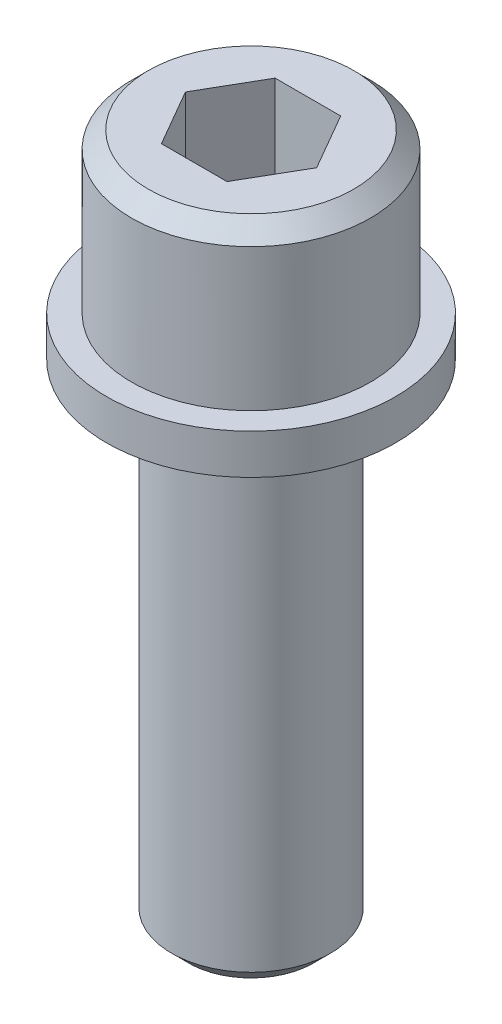
ISO-10303-21;
HEADER;
FILE_DESCRIPTION(('STEP AP214'),'2;1');
FILE_NAME('part.step','',(''),(''),'','','');
FILE_SCHEMA(('AUTOMOTIVE_DESIGN { 1 0 10303 214 1 1 1 1 }'));
ENDSEC;
DATA;
#1=APPLICATION_CONTEXT('core data for automotive mechanical design processes');
#2=APPLICATION_PROTOCOL_DEFINITION('international standard','automotive_design',2000,#1);
#3=PRODUCT_CONTEXT('',#1,'mechanical');
#4=PRODUCT('Part','Part','',(#3));
#5=PRODUCT_RELATED_PRODUCT_CATEGORY('part','',(#4));
#6=PRODUCT_DEFINITION_FORMATION('','',#4);
#7=PRODUCT_DEFINITION_CONTEXT('part definition',#1,'design');
#8=PRODUCT_DEFINITION('design','',#6,#7);
#9=PRODUCT_DEFINITION_SHAPE('','',#8);
#10=(LENGTH_UNIT() NAMED_UNIT(*) SI_UNIT(.MILLI.,.METRE.));
#11=(NAMED_UNIT(*) PLANE_ANGLE_UNIT() SI_UNIT($,.RADIAN.));
#12=(NAMED_UNIT(*) SI_UNIT($,.STERADIAN.) SOLID_ANGLE_UNIT());
#13=UNCERTAINTY_MEASURE_WITH_UNIT(LENGTH_MEASURE(1.E-05),#10,'distance_accuracy_value','');
#14=(GEOMETRIC_REPRESENTATION_CONTEXT(3) GLOBAL_UNCERTAINTY_ASSIGNED_CONTEXT((#13)) GLOBAL_UNIT_ASSIGNED_CONTEXT((#10,
#11,#12)) REPRESENTATION_CONTEXT('',''));
#15=CARTESIAN_POINT('',(0.,0.,0.));
#16=DIRECTION('',(0.,0.,1.));
#17=DIRECTION('',(1.,0.,0.));
#18=AXIS2_PLACEMENT_3D('',#15,#16,#17);
#19=CARTESIAN_POINT('',(4.75,0.,0.));
#20=DIRECTION('',(0.,-1.,0.));
#21=DIRECTION('',(0.,0.,-1.));
#22=AXIS2_PLACEMENT_3D('',#19,#20,#21);
#23=PLANE('',#22);
#24=CARTESIAN_POINT('',(0.,0.,0.));
#25=DIRECTION('',(0.,-1.,0.));
#26=DIRECTION('',(0.,0.,-1.));
#27=AXIS2_PLACEMENT_3D('',#24,#25,#26);
#28=CIRCLE('',#27,3.75);
#29=CARTESIAN_POINT('',(0.,0.,-3.75));
#30=VERTEX_POINT('',#29);
#31=EDGE_CURVE('E188',#30,#30,#28,.T.);
#32=ORIENTED_EDGE('',*,*,#31,.T.);
#33=EDGE_LOOP('',(#32));
#34=FACE_BOUND('',#33,.T.);
#35=ADVANCED_FACE('F47',(#34),#23,.T.);
#36=CARTESIAN_POINT('',(0.,41.3,0.));
#37=DIRECTION('',(0.,1.,0.));
#38=DIRECTION('',(0.,0.,1.));
#39=AXIS2_PLACEMENT_3D('',#36,#37,#38);
#40=PLANE('',#39);
#41=CARTESIAN_POINT('',(0.,41.3,0.));
#42=DIRECTION('',(0.,1.,0.));
#43=DIRECTION('',(0.,0.,1.));
#44=AXIS2_PLACEMENT_3D('',#41,#42,#43);
#45=CIRCLE('',#44,6.14999999999999);
#46=CARTESIAN_POINT('',(0.,41.3,6.14999999999999));
#47=VERTEX_POINT('',#46);
#48=EDGE_CURVE('E11',#47,#47,#45,.T.);
#49=ORIENTED_EDGE('',*,*,#48,.T.);
#50=EDGE_LOOP('',(#49));
#51=FACE_BOUND('',#50,.T.);
#52=DIRECTION('',(0.5,0.,-0.866025403784439));
#53=VECTOR('',#52,1.);
#54=CARTESIAN_POINT('',(1.96299091524473,41.3,3.4));
#55=LINE('',#54,#53);
#56=CARTESIAN_POINT('',(1.96299091524473,41.3,3.4));
#57=VERTEX_POINT('',#56);
#58=CARTESIAN_POINT('',(3.92598183048946,41.3,0.));
#59=VERTEX_POINT('',#58);
#60=EDGE_CURVE('E64',#57,#59,#55,.T.);
#61=ORIENTED_EDGE('',*,*,#60,.F.);
#62=DIRECTION('',(1.,0.,0.));
#63=VECTOR('',#62,1.);
#64=CARTESIAN_POINT('',(-1.96299091524473,41.3,3.4));
#65=LINE('',#64,#63);
#66=CARTESIAN_POINT('',(-1.96299091524473,41.3,3.4));
#67=VERTEX_POINT('',#66);
#68=EDGE_CURVE('E157',#67,#57,#65,.T.);
#69=ORIENTED_EDGE('',*,*,#68,.F.);
#70=DIRECTION('',(0.5,0.,0.866025403784439));
#71=VECTOR('',#70,1.);
#72=CARTESIAN_POINT('',(-3.92598183048946,41.3,0.));
#73=LINE('',#72,#71);
#74=CARTESIAN_POINT('',(-3.92598183048946,41.3,0.));
#75=VERTEX_POINT('',#74);
#76=EDGE_CURVE('E154',#75,#67,#73,.T.);
#77=ORIENTED_EDGE('',*,*,#76,.F.);
#78=DIRECTION('',(-0.5,0.,0.866025403784438));
#79=VECTOR('',#78,1.);
#80=CARTESIAN_POINT('',(-1.96299091524473,41.3,-3.4));
#81=LINE('',#80,#79);
#82=CARTESIAN_POINT('',(-1.96299091524473,41.3,-3.4));
#83=VERTEX_POINT('',#82);
#84=EDGE_CURVE('E112',#83,#75,#81,.T.);
#85=ORIENTED_EDGE('',*,*,#84,.F.);
#86=DIRECTION('',(-1.,0.,0.));
#87=VECTOR('',#86,1.);
#88=CARTESIAN_POINT('',(1.96299091524473,41.3,-3.4));
#89=LINE('',#88,#87);
#90=CARTESIAN_POINT('',(1.96299091524473,41.3,-3.4));
#91=VERTEX_POINT('',#90);
#92=EDGE_CURVE('E148',#91,#83,#89,.T.);
#93=ORIENTED_EDGE('',*,*,#92,.F.);
#94=DIRECTION('',(-0.5,0.,-0.866025403784438));
#95=VECTOR('',#94,1.);
#96=CARTESIAN_POINT('',(3.92598183048946,41.3,0.));
#97=LINE('',#96,#95);
#98=EDGE_CURVE('E144',#59,#91,#97,.T.);
#99=ORIENTED_EDGE('',*,*,#98,.F.);
#100=EDGE_LOOP('',(#61,#69,#77,#85,#93,#99));
#101=FACE_BOUND('',#100,.T.);
#102=ADVANCED_FACE('F211',(#51,#101),#40,.T.);
#103=CARTESIAN_POINT('',(0.,0.,0.));
#104=DIRECTION('',(0.,-1.,0.));
#105=DIRECTION('',(0.,0.,-1.));
#106=AXIS2_PLACEMENT_3D('',#103,#104,#105);
#107=CYLINDRICAL_SURFACE('',#106,7.15);
#108=CARTESIAN_POINT('',(0.,40.3,0.));
#109=DIRECTION('',(0.,1.,0.));
#110=DIRECTION('',(0.,0.,1.));
#111=AXIS2_PLACEMENT_3D('',#108,#109,#110);
#112=CIRCLE('',#111,7.15);
#113=CARTESIAN_POINT('',(0.,40.3,7.15));
#114=VERTEX_POINT('',#113);
#115=EDGE_CURVE('E57',#114,#114,#112,.F.);
#116=ORIENTED_EDGE('',*,*,#115,.T.);
#117=EDGE_LOOP('',(#116));
#118=FACE_BOUND('',#117,.T.);
#119=CARTESIAN_POINT('',(0.,31.8,0.));
#120=DIRECTION('',(0.,-1.,0.));
#121=DIRECTION('',(0.,0.,-1.));
#122=AXIS2_PLACEMENT_3D('',#119,#120,#121);
#123=CIRCLE('',#122,7.15);
#124=CARTESIAN_POINT('',(0.,31.8,-7.15));
#125=VERTEX_POINT('',#124);
#126=EDGE_CURVE('E184',#125,#125,#123,.T.);
#127=ORIENTED_EDGE('',*,*,#126,.F.);
#128=EDGE_LOOP('',(#127));
#129=FACE_BOUND('',#128,.T.);
#130=ADVANCED_FACE('F199',(#118,#129),#107,.T.);
#131=CARTESIAN_POINT('',(7.15,31.8,0.));
#132=DIRECTION('',(0.,1.,0.));
#133=DIRECTION('',(0.,0.,1.));
#134=AXIS2_PLACEMENT_3D('',#131,#132,#133);
#135=PLANE('',#134);
#136=ORIENTED_EDGE('',*,*,#126,.T.);
#137=EDGE_LOOP('',(#136));
#138=FACE_BOUND('',#137,.T.);
#139=CARTESIAN_POINT('',(0.,31.8,0.));
#140=DIRECTION('',(0.,-1.,0.));
#141=DIRECTION('',(0.,0.,-1.));
#142=AXIS2_PLACEMENT_3D('',#139,#140,#141);
#143=CIRCLE('',#142,8.65);
#144=CARTESIAN_POINT('',(0.,31.8,-8.65));
#145=VERTEX_POINT('',#144);
#146=EDGE_CURVE('E180',#145,#145,#143,.T.);
#147=ORIENTED_EDGE('',*,*,#146,.F.);
#148=EDGE_LOOP('',(#147));
#149=FACE_BOUND('',#148,.T.);
#150=ADVANCED_FACE('F228',(#138,#149),#135,.T.);
#151=CARTESIAN_POINT('',(0.,0.,0.));
#152=DIRECTION('',(0.,-1.,0.));
#153=DIRECTION('',(0.,0.,-1.));
#154=AXIS2_PLACEMENT_3D('',#151,#152,#153);
#155=CYLINDRICAL_SURFACE('',#154,8.65);
#156=ORIENTED_EDGE('',*,*,#146,.T.);
#157=EDGE_LOOP('',(#156));
#158=FACE_BOUND('',#157,.T.);
#159=CARTESIAN_POINT('',(0.,29.4,0.));
#160=DIRECTION('',(0.,-1.,0.));
#161=DIRECTION('',(0.,0.,-1.));
#162=AXIS2_PLACEMENT_3D('',#159,#160,#161);
#163=CIRCLE('',#162,8.65);
#164=CARTESIAN_POINT('',(0.,29.4,-8.65));
#165=VERTEX_POINT('',#164);
#166=EDGE_CURVE('E176',#165,#165,#163,.T.);
#167=ORIENTED_EDGE('',*,*,#166,.F.);
#168=EDGE_LOOP('',(#167));
#169=FACE_BOUND('',#168,.T.);
#170=ADVANCED_FACE('F231',(#158,#169),#155,.T.);
#171=CARTESIAN_POINT('',(8.65,29.4,0.));
#172=DIRECTION('',(0.,-1.,0.));
#173=DIRECTION('',(0.,0.,-1.));
#174=AXIS2_PLACEMENT_3D('',#171,#172,#173);
#175=PLANE('',#174);
#176=ORIENTED_EDGE('',*,*,#166,.T.);
#177=EDGE_LOOP('',(#176));
#178=FACE_BOUND('',#177,.T.);
#179=CARTESIAN_POINT('',(0.,29.4,0.));
#180=DIRECTION('',(0.,-1.,0.));
#181=DIRECTION('',(0.,0.,-1.));
#182=AXIS2_PLACEMENT_3D('',#179,#180,#181);
#183=CIRCLE('',#182,4.75);
#184=CARTESIAN_POINT('',(0.,29.4,-4.75));
#185=VERTEX_POINT('',#184);
#186=EDGE_CURVE('E163',#185,#185,#183,.T.);
#187=ORIENTED_EDGE('',*,*,#186,.F.);
#188=EDGE_LOOP('',(#187));
#189=FACE_BOUND('',#188,.T.);
#190=ADVANCED_FACE('F235',(#178,#189),#175,.T.);
#191=CARTESIAN_POINT('',(0.,0.,0.));
#192=DIRECTION('',(0.,-1.,0.));
#193=DIRECTION('',(0.,0.,-1.));
#194=AXIS2_PLACEMENT_3D('',#191,#192,#193);
#195=CYLINDRICAL_SURFACE('',#194,4.75);
#196=CARTESIAN_POINT('',(0.,1.,0.));
#197=DIRECTION('',(0.,-1.,0.));
#198=DIRECTION('',(0.,0.,-1.));
#199=AXIS2_PLACEMENT_3D('',#196,#197,#198);
#200=CIRCLE('',#199,4.75);
#201=CARTESIAN_POINT('',(0.,1.,-4.75));
#202=VERTEX_POINT('',#201);
#203=EDGE_CURVE('E192',#202,#202,#200,.F.);
#204=ORIENTED_EDGE('',*,*,#203,.T.);
#205=EDGE_LOOP('',(#204));
#206=FACE_BOUND('',#205,.T.);
#207=ORIENTED_EDGE('',*,*,#186,.T.);
#208=EDGE_LOOP('',(#207));
#209=FACE_BOUND('',#208,.T.);
#210=ADVANCED_FACE('F239',(#206,#209),#195,.T.);
#211=CARTESIAN_POINT('',(1.96299091524473,34.9,3.4));
#212=DIRECTION('',(0.866025403784439,0.,0.5));
#213=DIRECTION('',(0.5,0.,-0.866025403784439));
#214=AXIS2_PLACEMENT_3D('',#211,#212,#213);
#215=PLANE('',#214);
#216=ORIENTED_EDGE('',*,*,#60,.T.);
#217=DIRECTION('',(0.,1.,0.));
#218=VECTOR('',#217,1.);
#219=CARTESIAN_POINT('',(3.92598183048946,34.9,0.));
#220=LINE('',#219,#218);
#221=CARTESIAN_POINT('',(3.92598183048946,34.9,0.));
#222=VERTEX_POINT('',#221);
#223=EDGE_CURVE('E94',#222,#59,#220,.T.);
#224=ORIENTED_EDGE('',*,*,#223,.F.);
#225=DIRECTION('',(0.5,0.,-0.866025403784439));
#226=VECTOR('',#225,1.);
#227=CARTESIAN_POINT('',(1.96299091524473,34.9,3.4));
#228=LINE('',#227,#226);
#229=CARTESIAN_POINT('',(1.96299091524473,34.9,3.4));
#230=VERTEX_POINT('',#229);
#231=EDGE_CURVE('E160',#230,#222,#228,.T.);
#232=ORIENTED_EDGE('',*,*,#231,.F.);
#233=DIRECTION('',(0.,1.,0.));
#234=VECTOR('',#233,1.);
#235=CARTESIAN_POINT('',(1.96299091524473,34.9,3.4));
#236=LINE('',#235,#234);
#237=EDGE_CURVE('E72',#230,#57,#236,.T.);
#238=ORIENTED_EDGE('',*,*,#237,.T.);
#239=EDGE_LOOP('',(#216,#224,#232,#238));
#240=FACE_BOUND('',#239,.T.);
#241=ADVANCED_FACE('F243',(#240),#215,.F.);
#242=CARTESIAN_POINT('',(-1.96299091524473,34.9,3.4));
#243=DIRECTION('',(0.,0.,1.));
#244=DIRECTION('',(1.,0.,0.));
#245=AXIS2_PLACEMENT_3D('',#242,#243,#244);
#246=PLANE('',#245);
#247=ORIENTED_EDGE('',*,*,#68,.T.);
#248=ORIENTED_EDGE('',*,*,#237,.F.);
#249=DIRECTION('',(1.,0.,0.));
#250=VECTOR('',#249,1.);
#251=CARTESIAN_POINT('',(-1.96299091524473,34.9,3.4));
#252=LINE('',#251,#250);
#253=CARTESIAN_POINT('',(-1.96299091524473,34.9,3.4));
#254=VERTEX_POINT('',#253);
#255=EDGE_CURVE('E126',#254,#230,#252,.T.);
#256=ORIENTED_EDGE('',*,*,#255,.F.);
#257=DIRECTION('',(0.,1.,0.));
#258=VECTOR('',#257,1.);
#259=CARTESIAN_POINT('',(-1.96299091524473,34.9,3.4));
#260=LINE('',#259,#258);
#261=EDGE_CURVE('E117',#254,#67,#260,.T.);
#262=ORIENTED_EDGE('',*,*,#261,.T.);
#263=EDGE_LOOP('',(#247,#248,#256,#262));
#264=FACE_BOUND('',#263,.T.);
#265=ADVANCED_FACE('F247',(#264),#246,.F.);
#266=CARTESIAN_POINT('',(-3.92598183048946,34.9,0.));
#267=DIRECTION('',(-0.866025403784439,0.,0.5));
#268=DIRECTION('',(0.5,0.,0.866025403784439));
#269=AXIS2_PLACEMENT_3D('',#266,#267,#268);
#270=PLANE('',#269);
#271=ORIENTED_EDGE('',*,*,#76,.T.);
#272=ORIENTED_EDGE('',*,*,#261,.F.);
#273=DIRECTION('',(0.5,0.,0.866025403784439));
#274=VECTOR('',#273,1.);
#275=CARTESIAN_POINT('',(-3.92598183048946,34.9,0.));
#276=LINE('',#275,#274);
#277=CARTESIAN_POINT('',(-3.92598183048946,34.9,0.));
#278=VERTEX_POINT('',#277);
#279=EDGE_CURVE('E121',#278,#254,#276,.T.);
#280=ORIENTED_EDGE('',*,*,#279,.F.);
#281=DIRECTION('',(0.,1.,0.));
#282=VECTOR('',#281,1.);
#283=CARTESIAN_POINT('',(-3.92598183048946,34.9,0.));
#284=LINE('',#283,#282);
#285=EDGE_CURVE('E105',#278,#75,#284,.T.);
#286=ORIENTED_EDGE('',*,*,#285,.T.);
#287=EDGE_LOOP('',(#271,#272,#280,#286));
#288=FACE_BOUND('',#287,.T.);
#289=ADVANCED_FACE('F122',(#288),#270,.F.);
#290=CARTESIAN_POINT('',(-1.96299091524473,34.9,-3.4));
#291=DIRECTION('',(-0.866025403784438,0.,-0.5));
#292=DIRECTION('',(-0.5,0.,0.866025403784439));
#293=AXIS2_PLACEMENT_3D('',#290,#291,#292);
#294=PLANE('',#293);
#295=ORIENTED_EDGE('',*,*,#84,.T.);
#296=ORIENTED_EDGE('',*,*,#285,.F.);
#297=DIRECTION('',(-0.5,0.,0.866025403784438));
#298=VECTOR('',#297,1.);
#299=CARTESIAN_POINT('',(-1.96299091524473,34.9,-3.4));
#300=LINE('',#299,#298);
#301=CARTESIAN_POINT('',(-1.96299091524473,34.9,-3.4));
#302=VERTEX_POINT('',#301);
#303=EDGE_CURVE('E109',#302,#278,#300,.T.);
#304=ORIENTED_EDGE('',*,*,#303,.F.);
#305=DIRECTION('',(0.,1.,0.));
#306=VECTOR('',#305,1.);
#307=CARTESIAN_POINT('',(-1.96299091524473,34.9,-3.4));
#308=LINE('',#307,#306);
#309=EDGE_CURVE('E118',#302,#83,#308,.T.);
#310=ORIENTED_EDGE('',*,*,#309,.T.);
#311=EDGE_LOOP('',(#295,#296,#304,#310));
#312=FACE_BOUND('',#311,.T.);
#313=ADVANCED_FACE('F107',(#312),#294,.F.);
#314=CARTESIAN_POINT('',(1.96299091524473,34.9,-3.4));
#315=DIRECTION('',(0.,0.,-1.));
#316=DIRECTION('',(-1.,0.,0.));
#317=AXIS2_PLACEMENT_3D('',#314,#315,#316);
#318=PLANE('',#317);
#319=ORIENTED_EDGE('',*,*,#92,.T.);
#320=ORIENTED_EDGE('',*,*,#309,.F.);
#321=DIRECTION('',(-1.,0.,0.));
#322=VECTOR('',#321,1.);
#323=CARTESIAN_POINT('',(1.96299091524473,34.9,-3.4));
#324=LINE('',#323,#322);
#325=CARTESIAN_POINT('',(1.96299091524473,34.9,-3.4));
#326=VERTEX_POINT('',#325);
#327=EDGE_CURVE('E132',#326,#302,#324,.T.);
#328=ORIENTED_EDGE('',*,*,#327,.F.);
#329=DIRECTION('',(0.,1.,0.));
#330=VECTOR('',#329,1.);
#331=CARTESIAN_POINT('',(1.96299091524473,34.9,-3.4));
#332=LINE('',#331,#330);
#333=EDGE_CURVE('E168',#326,#91,#332,.T.);
#334=ORIENTED_EDGE('',*,*,#333,.T.);
#335=EDGE_LOOP('',(#319,#320,#328,#334));
#336=FACE_BOUND('',#335,.T.);
#337=ADVANCED_FACE('F251',(#336),#318,.F.);
#338=CARTESIAN_POINT('',(3.92598183048946,34.9,0.));
#339=DIRECTION('',(0.866025403784438,0.,-0.5));
#340=DIRECTION('',(-0.5,0.,-0.866025403784439));
#341=AXIS2_PLACEMENT_3D('',#338,#339,#340);
#342=PLANE('',#341);
#343=ORIENTED_EDGE('',*,*,#98,.T.);
#344=ORIENTED_EDGE('',*,*,#333,.F.);
#345=DIRECTION('',(-0.5,0.,-0.866025403784438));
#346=VECTOR('',#345,1.);
#347=CARTESIAN_POINT('',(3.92598183048946,34.9,0.));
#348=LINE('',#347,#346);
#349=EDGE_CURVE('E136',#222,#326,#348,.T.);
#350=ORIENTED_EDGE('',*,*,#349,.F.);
#351=ORIENTED_EDGE('',*,*,#223,.T.);
#352=EDGE_LOOP('',(#343,#344,#350,#351));
#353=FACE_BOUND('',#352,.T.);
#354=ADVANCED_FACE('F248',(#353),#342,.F.);
#355=CARTESIAN_POINT('',(0.,34.9,0.));
#356=DIRECTION('',(0.,1.,0.));
#357=DIRECTION('',(0.,0.,1.));
#358=AXIS2_PLACEMENT_3D('',#355,#356,#357);
#359=PLANE('',#358);
#360=ORIENTED_EDGE('',*,*,#231,.T.);
#361=ORIENTED_EDGE('',*,*,#349,.T.);
#362=ORIENTED_EDGE('',*,*,#327,.T.);
#363=ORIENTED_EDGE('',*,*,#303,.T.);
#364=ORIENTED_EDGE('',*,*,#279,.T.);
#365=ORIENTED_EDGE('',*,*,#255,.T.);
#366=EDGE_LOOP('',(#360,#361,#362,#363,#364,#365));
#367=FACE_BOUND('',#366,.T.);
#368=ADVANCED_FACE('F129',(#367),#359,.T.);
#369=CARTESIAN_POINT('',(0.,0.,0.));
#370=DIRECTION('',(0.,1.,0.));
#371=DIRECTION('',(0.,0.,1.));
#372=AXIS2_PLACEMENT_3D('',#369,#370,#371);
#373=CONICAL_SURFACE('',#372,3.75,0.785398163397447);
#374=ORIENTED_EDGE('',*,*,#203,.F.);
#375=EDGE_LOOP('',(#374));
#376=FACE_BOUND('',#375,.T.);
#377=ORIENTED_EDGE('',*,*,#31,.F.);
#378=EDGE_LOOP('',(#377));
#379=FACE_BOUND('',#378,.T.);
#380=ADVANCED_FACE('F203',(#376,#379),#373,.T.);
#381=CARTESIAN_POINT('',(0.,40.3,0.));
#382=DIRECTION('',(0.,-1.,0.));
#383=DIRECTION('',(0.,0.,-1.));
#384=AXIS2_PLACEMENT_3D('',#381,#382,#383);
#385=CONICAL_SURFACE('',#384,7.15,0.785398163397452);
#386=ORIENTED_EDGE('',*,*,#48,.F.);
#387=EDGE_LOOP('',(#386));
#388=FACE_BOUND('',#387,.T.);
#389=ORIENTED_EDGE('',*,*,#115,.F.);
#390=EDGE_LOOP('',(#389));
#391=FACE_BOUND('',#390,.T.);
#392=ADVANCED_FACE('F50',(#388,#391),#385,.T.);
#393=CLOSED_SHELL('',(#35,#102,#130,#150,#170,#190,#210,#241,#265,#289,#313,#337,#354,#368,#380,#392));
#394=MANIFOLD_SOLID_BREP('B2',#393);
#395=ADVANCED_BREP_SHAPE_REPRESENTATION('',(#18,#394),#14);
#396=SHAPE_DEFINITION_REPRESENTATION(#9,#395);
ENDSEC;
END-ISO-10303-21;
